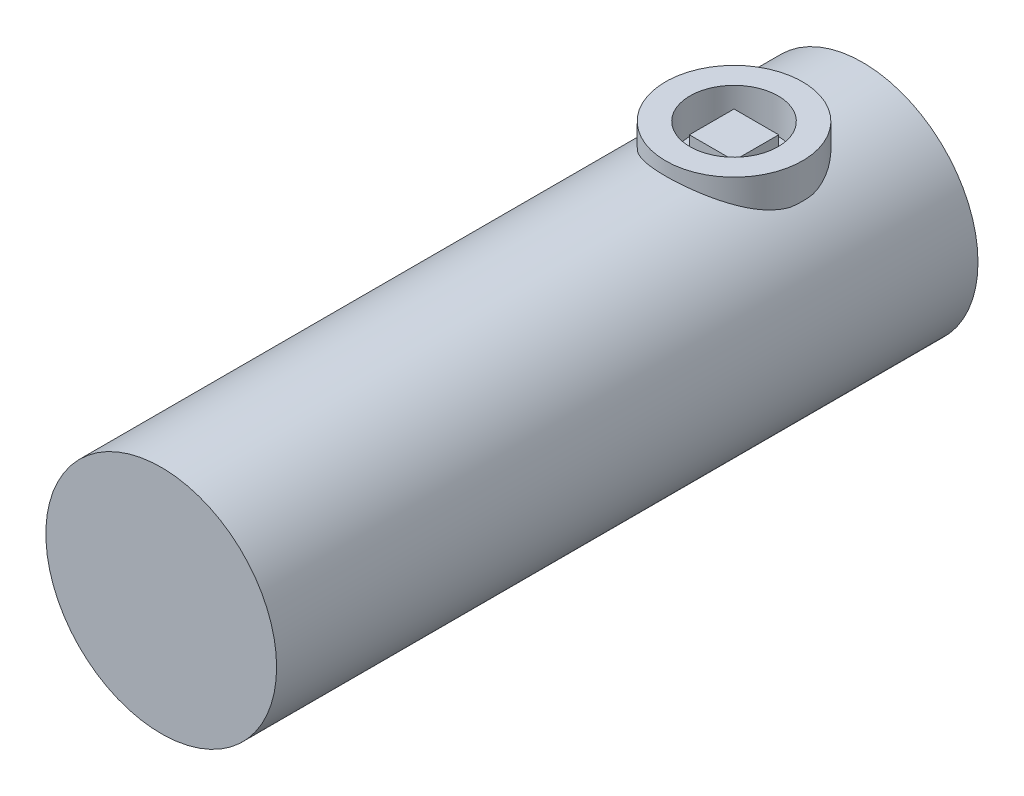
ISO-10303-21;
HEADER;
FILE_DESCRIPTION(('STEP AP214'),'2;1');
FILE_NAME('part.step','',(''),(''),'','','');
FILE_SCHEMA(('AUTOMOTIVE_DESIGN { 1 0 10303 214 1 1 1 1 }'));
ENDSEC;
DATA;
#1=APPLICATION_CONTEXT('core data for automotive mechanical design processes');
#2=APPLICATION_PROTOCOL_DEFINITION('international standard','automotive_design',2000,#1);
#3=PRODUCT_CONTEXT('',#1,'mechanical');
#4=PRODUCT('Part','Part','',(#3));
#5=PRODUCT_RELATED_PRODUCT_CATEGORY('part','',(#4));
#6=PRODUCT_DEFINITION_FORMATION('','',#4);
#7=PRODUCT_DEFINITION_CONTEXT('part definition',#1,'design');
#8=PRODUCT_DEFINITION('design','',#6,#7);
#9=PRODUCT_DEFINITION_SHAPE('','',#8);
#10=(LENGTH_UNIT() NAMED_UNIT(*) SI_UNIT(.MILLI.,.METRE.));
#11=(NAMED_UNIT(*) PLANE_ANGLE_UNIT() SI_UNIT($,.RADIAN.));
#12=(NAMED_UNIT(*) SI_UNIT($,.STERADIAN.) SOLID_ANGLE_UNIT());
#13=UNCERTAINTY_MEASURE_WITH_UNIT(LENGTH_MEASURE(1.E-05),#10,'distance_accuracy_value','');
#14=(GEOMETRIC_REPRESENTATION_CONTEXT(3) GLOBAL_UNCERTAINTY_ASSIGNED_CONTEXT((#13)) GLOBAL_UNIT_ASSIGNED_CONTEXT((#10,
#11,#12)) REPRESENTATION_CONTEXT('',''));
#15=CARTESIAN_POINT('',(0.,0.,0.));
#16=DIRECTION('',(0.,0.,1.));
#17=DIRECTION('',(1.,0.,0.));
#18=AXIS2_PLACEMENT_3D('',#15,#16,#17);
#19=CARTESIAN_POINT('',(0.,10.16,13.97));
#20=DIRECTION('',(0.,1.,0.));
#21=DIRECTION('',(0.,0.,1.));
#22=AXIS2_PLACEMENT_3D('',#19,#20,#21);
#23=PLANE('',#22);
#24=CARTESIAN_POINT('',(0.,10.16,13.97));
#25=DIRECTION('',(0.,1.,0.));
#26=DIRECTION('',(0.,0.,1.));
#27=AXIS2_PLACEMENT_3D('',#24,#25,#26);
#28=CIRCLE('',#27,4.7879);
#29=CARTESIAN_POINT('',(0.,10.16,9.1821));
#30=VERTEX_POINT('',#29);
#31=EDGE_CURVE('E142',#30,#30,#28,.T.);
#32=ORIENTED_EDGE('',*,*,#31,.T.);
#33=EDGE_LOOP('',(#32));
#34=FACE_BOUND('',#33,.T.);
#35=DIRECTION('',(-1.,0.,0.));
#36=VECTOR('',#35,1.);
#37=CARTESIAN_POINT('',(-2.4257,10.16,11.5443));
#38=LINE('',#37,#36);
#39=CARTESIAN_POINT('',(2.4257,10.16,11.5443));
#40=VERTEX_POINT('',#39);
#41=CARTESIAN_POINT('',(-2.4257,10.16,11.5443));
#42=VERTEX_POINT('',#41);
#43=EDGE_CURVE('E127',#40,#42,#38,.T.);
#44=ORIENTED_EDGE('',*,*,#43,.F.);
#45=DIRECTION('',(0.,0.,-1.));
#46=VECTOR('',#45,1.);
#47=CARTESIAN_POINT('',(2.4257,10.16,16.3957));
#48=LINE('',#47,#46);
#49=CARTESIAN_POINT('',(2.4257,10.16,16.3957));
#50=VERTEX_POINT('',#49);
#51=EDGE_CURVE('E113',#50,#40,#48,.T.);
#52=ORIENTED_EDGE('',*,*,#51,.F.);
#53=DIRECTION('',(1.,0.,0.));
#54=VECTOR('',#53,1.);
#55=CARTESIAN_POINT('',(-2.4257,10.16,16.3957));
#56=LINE('',#55,#54);
#57=CARTESIAN_POINT('',(-2.4257,10.16,16.3957));
#58=VERTEX_POINT('',#57);
#59=EDGE_CURVE('E118',#58,#50,#56,.T.);
#60=ORIENTED_EDGE('',*,*,#59,.F.);
#61=DIRECTION('',(0.,0.,1.));
#62=VECTOR('',#61,1.);
#63=CARTESIAN_POINT('',(-2.4257,10.16,16.3957));
#64=LINE('',#63,#62);
#65=EDGE_CURVE('E129',#42,#58,#64,.T.);
#66=ORIENTED_EDGE('',*,*,#65,.F.);
#67=EDGE_LOOP('',(#44,#52,#60,#66));
#68=FACE_BOUND('',#67,.T.);
#69=ADVANCED_FACE('F39',(#34,#68),#23,.T.);
#70=CARTESIAN_POINT('',(0.,86.36,13.97));
#71=DIRECTION('',(0.,-1.,0.));
#72=DIRECTION('',(0.,0.,-1.));
#73=AXIS2_PLACEMENT_3D('',#70,#71,#72);
#74=CYLINDRICAL_SURFACE('',#73,4.7879);
#75=CARTESIAN_POINT('',(0.,13.97,13.97));
#76=DIRECTION('',(0.,1.,0.));
#77=DIRECTION('',(0.,0.,1.));
#78=AXIS2_PLACEMENT_3D('',#75,#76,#77);
#79=CIRCLE('',#78,4.7879);
#80=CARTESIAN_POINT('',(0.,13.97,9.1821));
#81=VERTEX_POINT('',#80);
#82=EDGE_CURVE('E106',#81,#81,#79,.T.);
#83=CARTESIAN_POINT('',(0.,10.16,9.1821));
#84=CARTESIAN_POINT('',(0.,10.1996875,9.1821));
#85=CARTESIAN_POINT('',(0.,10.239375,9.1821));
#86=CARTESIAN_POINT('',(0.,10.31875,9.1821));
#87=CARTESIAN_POINT('',(0.,10.3584375,9.1821));
#88=CARTESIAN_POINT('',(0.,10.4378125,9.1821));
#89=CARTESIAN_POINT('',(0.,10.4775,9.1821));
#90=CARTESIAN_POINT('',(0.,10.556875,9.1821));
#91=CARTESIAN_POINT('',(0.,10.5965625,9.1821));
#92=CARTESIAN_POINT('',(0.,10.6759375,9.1821));
#93=CARTESIAN_POINT('',(0.,10.715625,9.1821));
#94=CARTESIAN_POINT('',(0.,10.795,9.1821));
#95=CARTESIAN_POINT('',(0.,10.8346875,9.1821));
#96=CARTESIAN_POINT('',(0.,10.9140625,9.1821));
#97=CARTESIAN_POINT('',(0.,10.95375,9.1821));
#98=CARTESIAN_POINT('',(0.,11.033125,9.1821));
#99=CARTESIAN_POINT('',(0.,11.0728125,9.1821));
#100=CARTESIAN_POINT('',(0.,11.1521875,9.1821));
#101=CARTESIAN_POINT('',(0.,11.191875,9.1821));
#102=CARTESIAN_POINT('',(0.,11.27125,9.1821));
#103=CARTESIAN_POINT('',(0.,11.3109375,9.1821));
#104=CARTESIAN_POINT('',(0.,11.3903125,9.1821));
#105=CARTESIAN_POINT('',(0.,11.43,9.1821));
#106=CARTESIAN_POINT('',(0.,11.509375,9.1821));
#107=CARTESIAN_POINT('',(0.,11.5490625,9.1821));
#108=CARTESIAN_POINT('',(0.,11.6284375,9.1821));
#109=CARTESIAN_POINT('',(0.,11.668125,9.1821));
#110=CARTESIAN_POINT('',(0.,11.7475,9.1821));
#111=CARTESIAN_POINT('',(0.,11.7871875,9.1821));
#112=CARTESIAN_POINT('',(0.,11.8665625,9.1821));
#113=CARTESIAN_POINT('',(0.,11.90625,9.1821));
#114=CARTESIAN_POINT('',(0.,11.985625,9.1821));
#115=CARTESIAN_POINT('',(0.,12.0253125,9.1821));
#116=CARTESIAN_POINT('',(0.,12.1046875,9.1821));
#117=CARTESIAN_POINT('',(0.,12.144375,9.1821));
#118=CARTESIAN_POINT('',(0.,12.22375,9.1821));
#119=CARTESIAN_POINT('',(0.,12.2634375,9.1821));
#120=CARTESIAN_POINT('',(0.,12.3428125,9.1821));
#121=CARTESIAN_POINT('',(0.,12.3825,9.1821));
#122=CARTESIAN_POINT('',(0.,12.461875,9.1821));
#123=CARTESIAN_POINT('',(0.,12.5015625,9.1821));
#124=CARTESIAN_POINT('',(0.,12.5809375,9.1821));
#125=CARTESIAN_POINT('',(0.,12.620625,9.1821));
#126=CARTESIAN_POINT('',(0.,12.7,9.1821));
#127=CARTESIAN_POINT('',(0.,12.7396875,9.1821));
#128=CARTESIAN_POINT('',(0.,12.8190625,9.1821));
#129=CARTESIAN_POINT('',(0.,12.85875,9.1821));
#130=CARTESIAN_POINT('',(0.,12.938125,9.1821));
#131=CARTESIAN_POINT('',(0.,12.9778125,9.1821));
#132=CARTESIAN_POINT('',(0.,13.0571875,9.1821));
#133=CARTESIAN_POINT('',(0.,13.096875,9.1821));
#134=CARTESIAN_POINT('',(0.,13.17625,9.1821));
#135=CARTESIAN_POINT('',(0.,13.2159375,9.1821));
#136=CARTESIAN_POINT('',(0.,13.2953125,9.1821));
#137=CARTESIAN_POINT('',(0.,13.335,9.1821));
#138=CARTESIAN_POINT('',(0.,13.414375,9.1821));
#139=CARTESIAN_POINT('',(0.,13.4540625,9.1821));
#140=CARTESIAN_POINT('',(0.,13.5334375,9.1821));
#141=CARTESIAN_POINT('',(0.,13.573125,9.1821));
#142=CARTESIAN_POINT('',(0.,13.6525,9.1821));
#143=CARTESIAN_POINT('',(0.,13.6921875,9.1821));
#144=CARTESIAN_POINT('',(0.,13.7715625,9.1821));
#145=CARTESIAN_POINT('',(0.,13.81125,9.1821));
#146=CARTESIAN_POINT('',(0.,13.890625,9.1821));
#147=CARTESIAN_POINT('',(0.,13.9303125,9.1821));
#148=CARTESIAN_POINT('',(0.,13.97,9.1821));
#149=B_SPLINE_CURVE_WITH_KNOTS('',3,(#83,#84,#85,#86,#87,#88,#89,#90,#91,#92,#93,#94,#95,#96,
#97,#98,#99,#100,#101,#102,#103,#104,#105,#106,#107,#108,#109,#110,#111,#112,#113,#114,#115,
#116,#117,#118,#119,#120,#121,#122,#123,#124,#125,#126,#127,#128,#129,#130,#131,#132,#133,#134,
#135,#136,#137,#138,#139,#140,#141,#142,#143,#144,#145,#146,#147,#148),.UNSPECIFIED.,.F.,.F.,(4,
2,2,2,2,2,2,2,2,2,2,2,2,2,2,2,2,2,2,2,2,2,2,2,2,2,2,2,2,2,2,2,4),(0.,0.119062500000003,
0.238125000000006,0.357187499999995,0.476249999999998,0.5953125,0.714375000000003,
0.833437500000006,0.952499999999995,1.0715625,1.190625,1.3096875,1.42875000000001,
1.54781250000001,1.666875,1.7859375,1.905,2.02406250000001,2.14312500000001,2.2621875,2.38125,
2.5003125,2.61937500000001,2.73843750000001,2.85750000000001,2.9765625,3.095625,
3.21468750000001,3.33375000000001,3.45281250000001,3.571875,3.6909375,3.81000000000001),.UNSPECIFIED.);
#150=EDGE_CURVE('BSEAM180',#30,#81,#149,.T.);
#151=ORIENTED_EDGE('',*,*,#31,.F.);
#152=ORIENTED_EDGE('',*,*,#82,.T.);
#153=ORIENTED_EDGE('',*,*,#150,.T.);
#154=ORIENTED_EDGE('',*,*,#150,.F.);
#155=EDGE_LOOP('',(#151,#153,#152,#154));
#156=FACE_BOUND('',#155,.T.);
#157=ADVANCED_FACE('F180',(#156),#74,.F.);
#158=CARTESIAN_POINT('',(2.4257,12.7,16.3957));
#159=DIRECTION('',(-1.,0.,0.));
#160=DIRECTION('',(0.,0.,1.));
#161=AXIS2_PLACEMENT_3D('',#158,#159,#160);
#162=PLANE('',#161);
#163=ORIENTED_EDGE('',*,*,#51,.T.);
#164=DIRECTION('',(0.,-1.,0.));
#165=VECTOR('',#164,1.);
#166=CARTESIAN_POINT('',(2.4257,12.7,11.5443));
#167=LINE('',#166,#165);
#168=CARTESIAN_POINT('',(2.4257,12.7,11.5443));
#169=VERTEX_POINT('',#168);
#170=EDGE_CURVE('E140',#169,#40,#167,.T.);
#171=ORIENTED_EDGE('',*,*,#170,.F.);
#172=DIRECTION('',(0.,0.,-1.));
#173=VECTOR('',#172,1.);
#174=CARTESIAN_POINT('',(2.4257,12.7,16.3957));
#175=LINE('',#174,#173);
#176=CARTESIAN_POINT('',(2.4257,12.7,16.3957));
#177=VERTEX_POINT('',#176);
#178=EDGE_CURVE('E114',#177,#169,#175,.T.);
#179=ORIENTED_EDGE('',*,*,#178,.F.);
#180=DIRECTION('',(0.,-1.,0.));
#181=VECTOR('',#180,1.);
#182=CARTESIAN_POINT('',(2.4257,12.7,16.3957));
#183=LINE('',#182,#181);
#184=EDGE_CURVE('E124',#177,#50,#183,.T.);
#185=ORIENTED_EDGE('',*,*,#184,.T.);
#186=EDGE_LOOP('',(#163,#171,#179,#185));
#187=FACE_BOUND('',#186,.T.);
#188=ADVANCED_FACE('F176',(#187),#162,.F.);
#189=CARTESIAN_POINT('',(-2.4257,12.7,11.5443));
#190=DIRECTION('',(0.,0.,1.));
#191=DIRECTION('',(1.,0.,0.));
#192=AXIS2_PLACEMENT_3D('',#189,#190,#191);
#193=PLANE('',#192);
#194=ORIENTED_EDGE('',*,*,#43,.T.);
#195=DIRECTION('',(0.,-1.,0.));
#196=VECTOR('',#195,1.);
#197=CARTESIAN_POINT('',(-2.4257,12.7,11.5443));
#198=LINE('',#197,#196);
#199=CARTESIAN_POINT('',(-2.4257,12.7,11.5443));
#200=VERTEX_POINT('',#199);
#201=EDGE_CURVE('E137',#200,#42,#198,.T.);
#202=ORIENTED_EDGE('',*,*,#201,.F.);
#203=DIRECTION('',(-1.,0.,0.));
#204=VECTOR('',#203,1.);
#205=CARTESIAN_POINT('',(-2.4257,12.7,11.5443));
#206=LINE('',#205,#204);
#207=EDGE_CURVE('E117',#169,#200,#206,.T.);
#208=ORIENTED_EDGE('',*,*,#207,.F.);
#209=ORIENTED_EDGE('',*,*,#170,.T.);
#210=EDGE_LOOP('',(#194,#202,#208,#209));
#211=FACE_BOUND('',#210,.T.);
#212=ADVANCED_FACE('F172',(#211),#193,.F.);
#213=CARTESIAN_POINT('',(-2.4257,12.7,16.3957));
#214=DIRECTION('',(1.,0.,0.));
#215=DIRECTION('',(0.,0.,-1.));
#216=AXIS2_PLACEMENT_3D('',#213,#214,#215);
#217=PLANE('',#216);
#218=ORIENTED_EDGE('',*,*,#65,.T.);
#219=DIRECTION('',(0.,-1.,0.));
#220=VECTOR('',#219,1.);
#221=CARTESIAN_POINT('',(-2.4257,12.7,16.3957));
#222=LINE('',#221,#220);
#223=CARTESIAN_POINT('',(-2.4257,12.7,16.3957));
#224=VERTEX_POINT('',#223);
#225=EDGE_CURVE('E135',#224,#58,#222,.T.);
#226=ORIENTED_EDGE('',*,*,#225,.F.);
#227=DIRECTION('',(0.,0.,1.));
#228=VECTOR('',#227,1.);
#229=CARTESIAN_POINT('',(-2.4257,12.7,16.3957));
#230=LINE('',#229,#228);
#231=EDGE_CURVE('E120',#200,#224,#230,.T.);
#232=ORIENTED_EDGE('',*,*,#231,.F.);
#233=ORIENTED_EDGE('',*,*,#201,.T.);
#234=EDGE_LOOP('',(#218,#226,#232,#233));
#235=FACE_BOUND('',#234,.T.);
#236=ADVANCED_FACE('F168',(#235),#217,.F.);
#237=CARTESIAN_POINT('',(-2.4257,12.7,16.3957));
#238=DIRECTION('',(0.,0.,-1.));
#239=DIRECTION('',(-1.,0.,0.));
#240=AXIS2_PLACEMENT_3D('',#237,#238,#239);
#241=PLANE('',#240);
#242=ORIENTED_EDGE('',*,*,#59,.T.);
#243=ORIENTED_EDGE('',*,*,#184,.F.);
#244=DIRECTION('',(1.,0.,0.));
#245=VECTOR('',#244,1.);
#246=CARTESIAN_POINT('',(-2.4257,12.7,16.3957));
#247=LINE('',#246,#245);
#248=EDGE_CURVE('E122',#224,#177,#247,.T.);
#249=ORIENTED_EDGE('',*,*,#248,.F.);
#250=ORIENTED_EDGE('',*,*,#225,.T.);
#251=EDGE_LOOP('',(#242,#243,#249,#250));
#252=FACE_BOUND('',#251,.T.);
#253=ADVANCED_FACE('F164',(#252),#241,.F.);
#254=CARTESIAN_POINT('',(0.,12.7,0.));
#255=DIRECTION('',(0.,-1.,0.));
#256=DIRECTION('',(0.,0.,-1.));
#257=AXIS2_PLACEMENT_3D('',#254,#255,#256);
#258=PLANE('',#257);
#259=ORIENTED_EDGE('',*,*,#178,.T.);
#260=ORIENTED_EDGE('',*,*,#207,.T.);
#261=ORIENTED_EDGE('',*,*,#231,.T.);
#262=ORIENTED_EDGE('',*,*,#248,.T.);
#263=EDGE_LOOP('',(#259,#260,#261,#262));
#264=FACE_BOUND('',#263,.T.);
#265=ADVANCED_FACE('F158',(#264),#258,.F.);
#266=CARTESIAN_POINT('',(0.,13.97,13.97));
#267=DIRECTION('',(0.,-1.,0.));
#268=DIRECTION('',(0.,0.,-1.));
#269=AXIS2_PLACEMENT_3D('',#266,#267,#268);
#270=CYLINDRICAL_SURFACE('',#269,7.4422);
#271=CARTESIAN_POINT('',(0.,13.97,13.97));
#272=DIRECTION('',(0.,1.,0.));
#273=DIRECTION('',(0.,0.,1.));
#274=AXIS2_PLACEMENT_3D('',#271,#272,#273);
#275=CIRCLE('',#274,7.4422);
#276=CARTESIAN_POINT('',(0.,13.97,21.4122));
#277=VERTEX_POINT('',#276);
#278=EDGE_CURVE('E96',#277,#277,#275,.T.);
#279=ORIENTED_EDGE('',*,*,#278,.F.);
#280=EDGE_LOOP('',(#279));
#281=FACE_BOUND('',#280,.T.);
#282=CARTESIAN_POINT('',(0.,10.16,13.97));
#283=DIRECTION('',(0.,1.,0.));
#284=DIRECTION('',(0.,0.,1.));
#285=AXIS2_PLACEMENT_3D('',#282,#283,#284);
#286=CIRCLE('',#285,7.4422);
#287=CARTESIAN_POINT('',(-7.34153376413948,10.16,12.7500726128167));
#288=VERTEX_POINT('',#287);
#289=CARTESIAN_POINT('',(-7.34153376413948,10.16,15.1899273871834));
#290=VERTEX_POINT('',#289);
#291=EDGE_CURVE('E101',#288,#290,#286,.T.);
#292=ORIENTED_EDGE('',*,*,#291,.T.);
#293=CARTESIAN_POINT('',(-7.34153376413948,10.16,15.1899273871833));
#294=CARTESIAN_POINT('',(-7.30798655702632,10.184205806823,15.3919905376023));
#295=CARTESIAN_POINT('',(-7.26617421845033,10.2142029078313,15.5918691684689));
#296=CARTESIAN_POINT('',(-7.16690347677361,10.2841175090633,15.9856618605665));
#297=CARTESIAN_POINT('',(-7.10946522624493,10.3240222257894,16.1795832487292));
#298=CARTESIAN_POINT('',(-6.98012514375669,10.411896278685,16.5592507182407));
#299=CARTESIAN_POINT('',(-6.90831203421277,10.4598158620881,16.7450388212875));
#300=CARTESIAN_POINT('',(-6.75080906760868,10.5621555675379,17.1088240525233));
#301=CARTESIAN_POINT('',(-6.66511466080792,10.6165778193626,17.2868186019126));
#302=CARTESIAN_POINT('',(-6.48104725845217,10.729927733339,17.6334243113398));
#303=CARTESIAN_POINT('',(-6.38273776517886,10.7888322658247,17.8020767913205));
#304=CARTESIAN_POINT('',(-6.17382215031373,10.9097316295888,18.1303049839895));
#305=CARTESIAN_POINT('',(-6.06321723448461,10.9717261575155,18.289881584397));
#306=CARTESIAN_POINT('',(-5.71316951124922,11.1603539754779,18.755049574959));
#307=CARTESIAN_POINT('',(-5.45577536641227,11.2894506267581,19.0465517029847));
#308=CARTESIAN_POINT('',(-5.02089767852393,11.4866800325246,19.4676521821105));
#309=CARTESIAN_POINT('',(-4.8581361052406,11.5566254258945,19.6120203680548));
#310=CARTESIAN_POINT('',(-4.51974558498577,11.6931102092912,19.886556465538));
#311=CARTESIAN_POINT('',(-4.34412252280564,11.7596511336551,20.0167308044666));
#312=CARTESIAN_POINT('',(-3.98084612437712,11.8875425488464,20.261837199158));
#313=CARTESIAN_POINT('',(-3.79319634049609,11.9488945600314,20.3767737252586));
#314=CARTESIAN_POINT('',(-3.40680413669373,12.0647445888337,20.590327122275));
#315=CARTESIAN_POINT('',(-3.20806265310052,12.1192431837361,20.6889453679529));
#316=CARTESIAN_POINT('',(-2.80854644292557,12.2178756160624,20.8652329403397));
#317=CARTESIAN_POINT('',(-2.60814058160743,12.2623262864866,20.9435595292568));
#318=CARTESIAN_POINT('',(-2.19964454120865,12.3421463608436,21.0829789232211));
#319=CARTESIAN_POINT('',(-1.99155443856486,12.3775158550811,21.1440718996425));
#320=CARTESIAN_POINT('',(-1.56962399626523,12.4380615156711,21.2480342293268));
#321=CARTESIAN_POINT('',(-1.3557894093214,12.463247502031,21.2909211407906));
#322=CARTESIAN_POINT('',(-0.924200223055846,12.5026596380013,21.3578181200302));
#323=CARTESIAN_POINT('',(-0.70644624130504,12.516887499055,21.3818311355486));
#324=CARTESIAN_POINT('',(-0.299096206318304,12.532755982527,21.4085942966121));
#325=CARTESIAN_POINT('',(-0.109713056832153,12.535849447383,21.4137990380339));
#326=CARTESIAN_POINT('',(0.268843052424782,12.5334455105061,21.4097503036177));
#327=CARTESIAN_POINT('',(0.458016021889044,12.5279485229494,21.4004975248282));
#328=CARTESIAN_POINT('',(0.834644705299203,12.5085029086891,21.3676645867042));
#329=CARTESIAN_POINT('',(1.02210063285688,12.4945553481991,21.3440862348342));
#330=CARTESIAN_POINT('',(1.39391926864851,12.4585550766688,21.2829220104001));
#331=CARTESIAN_POINT('',(1.57828193952271,12.4365022678084,21.245335968781));
#332=CARTESIAN_POINT('',(1.9350885942985,12.3858899753269,21.1584688708642));
#333=CARTESIAN_POINT('',(2.10771022014045,12.357637169767,21.1097355279137));
#334=CARTESIAN_POINT('',(2.44798911696979,12.2947557282209,21.0003374047119));
#335=CARTESIAN_POINT('',(2.61564478397555,12.260125057729,20.9396688167571));
#336=CARTESIAN_POINT('',(2.94503416851208,12.1851960008153,20.8070039525293));
#337=CARTESIAN_POINT('',(3.10676983871956,12.144899504857,20.7350114536537));
#338=CARTESIAN_POINT('',(3.42369401784901,12.0593958555432,20.5802793918402));
#339=CARTESIAN_POINT('',(3.57888011629357,12.0141869157403,20.4975359170727));
#340=CARTESIAN_POINT('',(4.06123998917402,11.8638015818962,20.2180905345022));
#341=CARTESIAN_POINT('',(4.37512992309409,11.7508481664532,20.0021917281447));
#342=CARTESIAN_POINT('',(4.96442050991501,11.514311847393,19.527379530838));
#343=CARTESIAN_POINT('',(5.23976632811979,11.3907141962725,19.268405982349));
#344=CARTESIAN_POINT('',(5.63785729036845,11.1966071105322,18.8327619640484));
#345=CARTESIAN_POINT('',(5.77505213732737,11.1262849832647,18.6690123872319));
#346=CARTESIAN_POINT('',(6.03518708641873,10.9873560901661,18.3298845025128));
#347=CARTESIAN_POINT('',(6.15812476881268,10.9187496170627,18.1545042285544));
#348=CARTESIAN_POINT('',(6.50386942789026,10.7188609212432,17.6126606319995));
#349=CARTESIAN_POINT('',(6.70458615235146,10.5930103416639,17.2294266681102));
#350=CARTESIAN_POINT('',(6.97944840597823,10.4128673545069,16.5685762777789));
#351=CARTESIAN_POINT('',(7.07324781941928,10.3490136566558,16.3015891400084));
#352=CARTESIAN_POINT('',(7.1912751024167,10.2670134418315,15.8915100460172));
#353=CARTESIAN_POINT('',(7.22687027071404,10.2419532444989,15.7530314630974));
#354=CARTESIAN_POINT('',(7.29018676559122,10.196978405933,15.4733675404743));
#355=CARTESIAN_POINT('',(7.3179028070202,10.1770672193517,15.3321804514128));
#356=CARTESIAN_POINT('',(7.34153376413948,10.16,15.1899273871833));
#357=B_SPLINE_CURVE_WITH_KNOTS('',3,(#293,#294,#295,#296,#297,#298,#299,#300,#301,#302,#303,
#304,#305,#306,#307,#308,#309,#310,#311,#312,#313,#314,#315,#316,#317,#318,#319,#320,#321,#322,
#323,#324,#325,#326,#327,#328,#329,#330,#331,#332,#333,#334,#335,#336,#337,#338,#339,#340,#341,
#342,#343,#344,#345,#346,#347,#348,#349,#350,#351,#352,#353,#354,#355,#356),.UNSPECIFIED.,.F.,
.F.,(4,2,2,2,2,2,2,2,2,2,2,2,2,2,2,2,2,2,2,2,2,2,2,2,2,2,2,2,2,2,2,4),(0.,0.618339560986475,
1.2358854059098,1.84973114562956,2.46377848833589,3.07484791143919,3.68585746219467,
4.90973275517486,5.59467633149195,6.27930844579566,6.96373926208588,7.6481123879111,
8.30629543966243,8.96447194608483,9.62201224721141,10.2794498326673,10.8471636982199,
11.414850193112,11.9824650775946,12.5500868126916,13.0942427945105,13.6385726608648,
14.1827213348212,14.7270685590627,15.9141604822754,17.1029244192225,17.776924814669,
18.4510394351606,19.7947268260697,20.662809299669,21.0979805801217,21.5334430791429),.UNSPECIFIED.);
#358=CARTESIAN_POINT('',(7.34153376413948,10.16,15.1899273871834));
#359=VERTEX_POINT('',#358);
#360=EDGE_CURVE('E11',#290,#359,#357,.T.);
#361=ORIENTED_EDGE('',*,*,#360,.T.);
#362=CARTESIAN_POINT('',(7.34153376413948,10.16,12.7500726128167));
#363=VERTEX_POINT('',#362);
#364=EDGE_CURVE('E103',#359,#363,#286,.T.);
#365=ORIENTED_EDGE('',*,*,#364,.T.);
#366=CARTESIAN_POINT('',(7.34153376413948,10.16,12.7500726128167));
#367=CARTESIAN_POINT('',(7.30798655702632,10.184205806823,12.5480094623977));
#368=CARTESIAN_POINT('',(7.26617421845033,10.2142029078313,12.3481308315311));
#369=CARTESIAN_POINT('',(7.16690347677361,10.2841175090633,11.9543381394335));
#370=CARTESIAN_POINT('',(7.10946522624493,10.3240222257894,11.7604167512708));
#371=CARTESIAN_POINT('',(6.98012514375669,10.411896278685,11.3807492817593));
#372=CARTESIAN_POINT('',(6.90831203421277,10.4598158620881,11.1949611787125));
#373=CARTESIAN_POINT('',(6.75080906760869,10.5621555675379,10.8311759474767));
#374=CARTESIAN_POINT('',(6.66511466080793,10.6165778193626,10.6531813980874));
#375=CARTESIAN_POINT('',(6.48104725845217,10.729927733339,10.3065756886602));
#376=CARTESIAN_POINT('',(6.38273776517886,10.7888322658247,10.1379232086795));
#377=CARTESIAN_POINT('',(6.17382215031373,10.9097316295888,9.80969501601047));
#378=CARTESIAN_POINT('',(6.06321723448461,10.9717261575155,9.65011841560299));
#379=CARTESIAN_POINT('',(5.71316951124922,11.1603539754779,9.18495042504105));
#380=CARTESIAN_POINT('',(5.45577536641227,11.2894506267581,8.89344829701532));
#381=CARTESIAN_POINT('',(5.02089767852394,11.4866800325246,8.47234781788952));
#382=CARTESIAN_POINT('',(4.85813610524061,11.5566254258944,8.32797963194524));
#383=CARTESIAN_POINT('',(4.51974558498578,11.6931102092912,8.05344353446196));
#384=CARTESIAN_POINT('',(4.34412252280565,11.7596511336551,7.92326919553341));
#385=CARTESIAN_POINT('',(3.98084612437714,11.8875425488464,7.67816280084201));
#386=CARTESIAN_POINT('',(3.7931963404961,11.9488945600314,7.56322627474143));
#387=CARTESIAN_POINT('',(3.40680413669374,12.0647445888337,7.34967287772505));
#388=CARTESIAN_POINT('',(3.20806265310053,12.1192431837361,7.25105463204709));
#389=CARTESIAN_POINT('',(2.80854644292559,12.2178756160624,7.07476705966034));
#390=CARTESIAN_POINT('',(2.60814058160744,12.2623262864866,6.99644047074318));
#391=CARTESIAN_POINT('',(2.19964454120867,12.3421463608436,6.85702107677891));
#392=CARTESIAN_POINT('',(1.99155443856488,12.3775158550811,6.79592810035747));
#393=CARTESIAN_POINT('',(1.56962399626524,12.4380615156711,6.69196577067319));
#394=CARTESIAN_POINT('',(1.35578940932141,12.463247502031,6.6490788592094));
#395=CARTESIAN_POINT('',(0.924200223055861,12.5026596380013,6.58218187996976));
#396=CARTESIAN_POINT('',(0.706446241305055,12.516887499055,6.55816886445137));
#397=CARTESIAN_POINT('',(0.299096206318318,12.532755982527,6.53140570338786));
#398=CARTESIAN_POINT('',(0.109713056832167,12.535849447383,6.52620096196607));
#399=CARTESIAN_POINT('',(-0.268843052424769,12.5334455105061,6.53024969638227));
#400=CARTESIAN_POINT('',(-0.458016021889032,12.5279485229494,6.53950247517179));
#401=CARTESIAN_POINT('',(-0.834644705299191,12.5085029086891,6.57233541329581));
#402=CARTESIAN_POINT('',(-1.02210063285687,12.4945553481991,6.59591376516585));
#403=CARTESIAN_POINT('',(-1.3939192686485,12.4585550766688,6.6570779895999));
#404=CARTESIAN_POINT('',(-1.5782819395227,12.4365022678084,6.69466403121899));
#405=CARTESIAN_POINT('',(-1.93508859429849,12.3858899753269,6.7815311291358));
#406=CARTESIAN_POINT('',(-2.10771022014044,12.357637169767,6.83026447208626));
#407=CARTESIAN_POINT('',(-2.44798911696978,12.2947557282209,6.93966259528812));
#408=CARTESIAN_POINT('',(-2.61564478397554,12.260125057729,7.00033118324293));
#409=CARTESIAN_POINT('',(-2.94503416851207,12.1851960008153,7.1329960474707));
#410=CARTESIAN_POINT('',(-3.10676983871956,12.144899504857,7.20498854634634));
#411=CARTESIAN_POINT('',(-3.42369401784901,12.0593958555432,7.35972060815978));
#412=CARTESIAN_POINT('',(-3.57888011629357,12.0141869157403,7.4424640829273));
#413=CARTESIAN_POINT('',(-4.06123998917401,11.8638015818962,7.72190946549784));
#414=CARTESIAN_POINT('',(-4.37512992309409,11.7508481664532,7.93780827185527));
#415=CARTESIAN_POINT('',(-4.96442050991501,11.514311847393,8.41262046916203));
#416=CARTESIAN_POINT('',(-5.23976632811978,11.3907141962725,8.67159401765095));
#417=CARTESIAN_POINT('',(-5.63785729036845,11.1966071105322,9.10723803595162));
#418=CARTESIAN_POINT('',(-5.77505213732736,11.1262849832647,9.27098761276813));
#419=CARTESIAN_POINT('',(-6.03518708641872,10.9873560901661,9.61011549748718));
#420=CARTESIAN_POINT('',(-6.15812476881268,10.9187496170627,9.78549577144562));
#421=CARTESIAN_POINT('',(-6.50386942789026,10.7188609212432,10.3273393680005));
#422=CARTESIAN_POINT('',(-6.70458615235146,10.5930103416639,10.7105733318898));
#423=CARTESIAN_POINT('',(-6.97944840597823,10.4128673545069,11.3714237222211));
#424=CARTESIAN_POINT('',(-7.07324781941928,10.3490136566558,11.6384108599916));
#425=CARTESIAN_POINT('',(-7.1912751024167,10.2670134418315,12.0484899539828));
#426=CARTESIAN_POINT('',(-7.22687027071404,10.2419532444989,12.1869685369026));
#427=CARTESIAN_POINT('',(-7.29018676559122,10.196978405933,12.4666324595257));
#428=CARTESIAN_POINT('',(-7.3179028070202,10.1770672193517,12.6078195485872));
#429=CARTESIAN_POINT('',(-7.34153376413948,10.16,12.7500726128167));
#430=B_SPLINE_CURVE_WITH_KNOTS('',3,(#366,#367,#368,#369,#370,#371,#372,#373,#374,#375,#376,
#377,#378,#379,#380,#381,#382,#383,#384,#385,#386,#387,#388,#389,#390,#391,#392,#393,#394,#395,
#396,#397,#398,#399,#400,#401,#402,#403,#404,#405,#406,#407,#408,#409,#410,#411,#412,#413,#414,
#415,#416,#417,#418,#419,#420,#421,#422,#423,#424,#425,#426,#427,#428,#429),.UNSPECIFIED.,.F.,
.F.,(4,2,2,2,2,2,2,2,2,2,2,2,2,2,2,2,2,2,2,2,2,2,2,2,2,2,2,2,2,2,2,4),(0.,0.618339560986471,
1.23588540590979,1.84973114562956,2.46377848833589,3.07484791143919,3.68585746219466,
4.90973275517485,5.59467633149193,6.27930844579564,6.96373926208587,7.64811238791108,
8.30629543966242,8.96447194608481,9.62201224721139,10.2794498326673,10.8471636982199,
11.414850193112,11.9824650775946,12.5500868126916,13.0942427945105,13.6385726608648,
14.1827213348212,14.7270685590627,15.9141604822753,17.1029244192225,17.776924814669,
18.4510394351606,19.7947268260697,20.662809299669,21.0979805801217,21.5334430791429),.UNSPECIFIED.);
#431=EDGE_CURVE('E53',#363,#288,#430,.T.);
#432=ORIENTED_EDGE('',*,*,#431,.T.);
#433=EDGE_LOOP('',(#292,#361,#365,#432));
#434=FACE_BOUND('',#433,.T.);
#435=ADVANCED_FACE('F100',(#281,#434),#270,.T.);
#436=CARTESIAN_POINT('',(0.,10.16,13.97));
#437=DIRECTION('',(0.,1.,0.));
#438=DIRECTION('',(0.,0.,1.));
#439=AXIS2_PLACEMENT_3D('',#436,#437,#438);
#440=PLANE('',#439);
#441=ORIENTED_EDGE('',*,*,#364,.F.);
#442=DIRECTION('',(0.,0.,-1.));
#443=VECTOR('',#442,1.);
#444=CARTESIAN_POINT('',(7.34153376413948,10.16,76.2));
#445=LINE('',#444,#443);
#446=EDGE_CURVE('E60',#359,#363,#445,.T.);
#447=ORIENTED_EDGE('',*,*,#446,.T.);
#448=EDGE_LOOP('',(#441,#447));
#449=FACE_BOUND('',#448,.T.);
#450=ADVANCED_FACE('F157',(#449),#440,.F.);
#451=ORIENTED_EDGE('',*,*,#291,.F.);
#452=DIRECTION('',(0.,0.,-1.));
#453=VECTOR('',#452,1.);
#454=CARTESIAN_POINT('',(-7.34153376413948,10.16,76.2));
#455=LINE('',#454,#453);
#456=EDGE_CURVE('E91',#288,#290,#455,.F.);
#457=ORIENTED_EDGE('',*,*,#456,.T.);
#458=EDGE_LOOP('',(#451,#457));
#459=FACE_BOUND('',#458,.T.);
#460=ADVANCED_FACE('F105',(#459),#440,.F.);
#461=CARTESIAN_POINT('',(0.,13.97,13.97));
#462=DIRECTION('',(0.,1.,0.));
#463=DIRECTION('',(0.,0.,1.));
#464=AXIS2_PLACEMENT_3D('',#461,#462,#463);
#465=PLANE('',#464);
#466=ORIENTED_EDGE('',*,*,#278,.T.);
#467=EDGE_LOOP('',(#466));
#468=FACE_BOUND('',#467,.T.);
#469=ORIENTED_EDGE('',*,*,#82,.F.);
#470=EDGE_LOOP('',(#469));
#471=FACE_BOUND('',#470,.T.);
#472=ADVANCED_FACE('F191',(#468,#471),#465,.T.);
#473=CARTESIAN_POINT('',(0.,0.,76.2));
#474=DIRECTION('',(0.,0.,1.));
#475=DIRECTION('',(1.,0.,0.));
#476=AXIS2_PLACEMENT_3D('',#473,#474,#475);
#477=PLANE('',#476);
#478=CARTESIAN_POINT('',(0.,0.,76.2));
#479=DIRECTION('',(0.,0.,1.));
#480=DIRECTION('',(1.,0.,0.));
#481=AXIS2_PLACEMENT_3D('',#478,#479,#480);
#482=CIRCLE('',#481,12.5349);
#483=CARTESIAN_POINT('',(12.5349,0.,76.2));
#484=VERTEX_POINT('',#483);
#485=EDGE_CURVE('E104',#484,#484,#482,.T.);
#486=ORIENTED_EDGE('',*,*,#485,.T.);
#487=EDGE_LOOP('',(#486));
#488=FACE_BOUND('',#487,.T.);
#489=ADVANCED_FACE('F188',(#488),#477,.T.);
#490=CARTESIAN_POINT('',(0.,0.,0.));
#491=DIRECTION('',(0.,0.,1.));
#492=DIRECTION('',(1.,0.,0.));
#493=AXIS2_PLACEMENT_3D('',#490,#491,#492);
#494=PLANE('',#493);
#495=CARTESIAN_POINT('',(0.,0.,0.));
#496=DIRECTION('',(0.,0.,1.));
#497=DIRECTION('',(1.,0.,0.));
#498=AXIS2_PLACEMENT_3D('',#495,#496,#497);
#499=CIRCLE('',#498,12.5349);
#500=CARTESIAN_POINT('',(12.5349,0.,0.));
#501=VERTEX_POINT('',#500);
#502=EDGE_CURVE('E145',#501,#501,#499,.T.);
#503=ORIENTED_EDGE('',*,*,#502,.F.);
#504=EDGE_LOOP('',(#503));
#505=FACE_BOUND('',#504,.T.);
#506=ADVANCED_FACE('F190',(#505),#494,.F.);
#507=CARTESIAN_POINT('',(0.,0.,76.2));
#508=DIRECTION('',(0.,0.,-1.));
#509=DIRECTION('',(-1.,0.,0.));
#510=AXIS2_PLACEMENT_3D('',#507,#508,#509);
#511=CYLINDRICAL_SURFACE('',#510,12.5349);
#512=ORIENTED_EDGE('',*,*,#502,.T.);
#513=EDGE_LOOP('',(#512));
#514=FACE_BOUND('',#513,.T.);
#515=ORIENTED_EDGE('',*,*,#485,.F.);
#516=EDGE_LOOP('',(#515));
#517=FACE_BOUND('',#516,.T.);
#518=ORIENTED_EDGE('',*,*,#360,.F.);
#519=ORIENTED_EDGE('',*,*,#456,.F.);
#520=ORIENTED_EDGE('',*,*,#431,.F.);
#521=ORIENTED_EDGE('',*,*,#446,.F.);
#522=EDGE_LOOP('',(#518,#519,#520,#521));
#523=FACE_BOUND('',#522,.T.);
#524=ADVANCED_FACE('F41',(#514,#517,#523),#511,.T.);
#525=CLOSED_SHELL('',(#69,#157,#188,#212,#236,#253,#265,#435,#450,#460,#472,#489,#506,#524));
#526=MANIFOLD_SOLID_BREP('B2',#525);
#527=ADVANCED_BREP_SHAPE_REPRESENTATION('',(#18,#526),#14);
#528=SHAPE_DEFINITION_REPRESENTATION(#9,#527);
ENDSEC;
END-ISO-10303-21;
